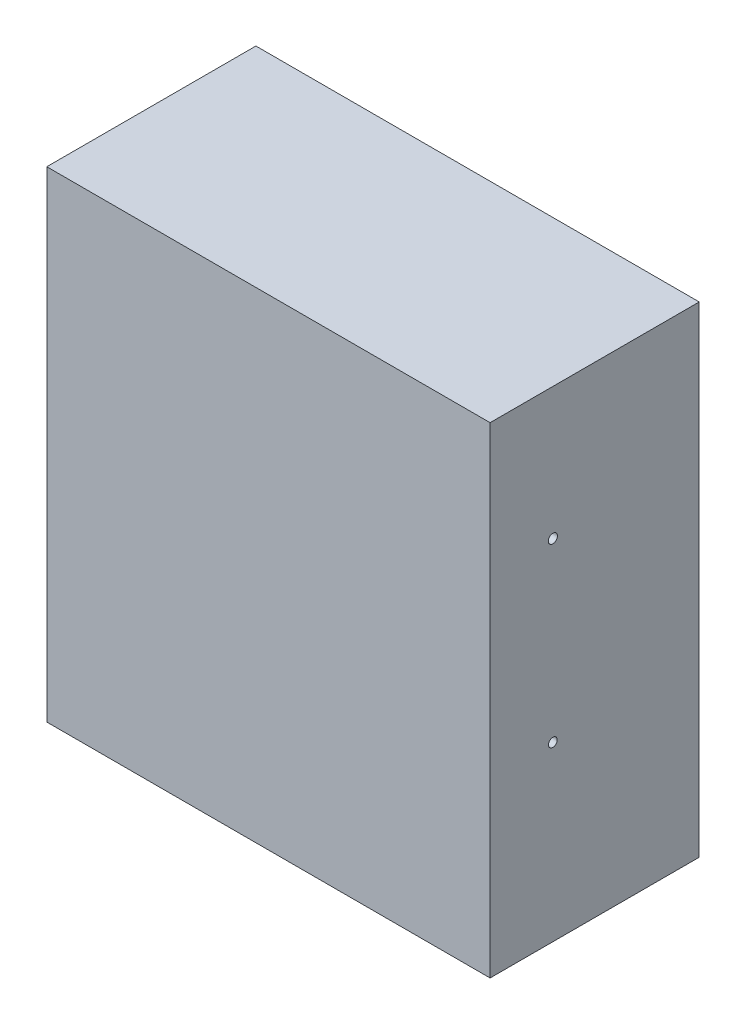
ISO-10303-21;
HEADER;
FILE_DESCRIPTION(('STEP AP214'),'2;1');
FILE_NAME('part.step','',(''),(''),'','','');
FILE_SCHEMA(('AUTOMOTIVE_DESIGN { 1 0 10303 214 1 1 1 1 }'));
ENDSEC;
DATA;
#1=APPLICATION_CONTEXT('core data for automotive mechanical design processes');
#2=APPLICATION_PROTOCOL_DEFINITION('international standard','automotive_design',2000,#1);
#3=PRODUCT_CONTEXT('',#1,'mechanical');
#4=PRODUCT('Part','Part','',(#3));
#5=PRODUCT_RELATED_PRODUCT_CATEGORY('part','',(#4));
#6=PRODUCT_DEFINITION_FORMATION('','',#4);
#7=PRODUCT_DEFINITION_CONTEXT('part definition',#1,'design');
#8=PRODUCT_DEFINITION('design','',#6,#7);
#9=PRODUCT_DEFINITION_SHAPE('','',#8);
#10=(LENGTH_UNIT() NAMED_UNIT(*) SI_UNIT(.MILLI.,.METRE.));
#11=(NAMED_UNIT(*) PLANE_ANGLE_UNIT() SI_UNIT($,.RADIAN.));
#12=(NAMED_UNIT(*) SI_UNIT($,.STERADIAN.) SOLID_ANGLE_UNIT());
#13=UNCERTAINTY_MEASURE_WITH_UNIT(LENGTH_MEASURE(1.E-05),#10,'distance_accuracy_value','');
#14=(GEOMETRIC_REPRESENTATION_CONTEXT(3) GLOBAL_UNCERTAINTY_ASSIGNED_CONTEXT((#13)) GLOBAL_UNIT_ASSIGNED_CONTEXT((#10,
#11,#12)) REPRESENTATION_CONTEXT('',''));
#15=CARTESIAN_POINT('',(0.,0.,0.));
#16=DIRECTION('',(0.,0.,1.));
#17=DIRECTION('',(1.,0.,0.));
#18=AXIS2_PLACEMENT_3D('',#15,#16,#17);
#19=CARTESIAN_POINT('',(106.,115.,100.));
#20=DIRECTION('',(-1.,0.,0.));
#21=DIRECTION('',(0.,0.,1.));
#22=AXIS2_PLACEMENT_3D('',#19,#20,#21);
#23=PLANE('',#22);
#24=CARTESIAN_POINT('',(106.,-32.4,69.9888516911841));
#25=DIRECTION('',(1.,0.,0.));
#26=DIRECTION('',(0.,0.,-1.));
#27=AXIS2_PLACEMENT_3D('',#24,#25,#26);
#28=CIRCLE('',#27,2.1);
#29=CARTESIAN_POINT('',(106.,-32.4,67.8888516911841));
#30=VERTEX_POINT('',#29);
#31=EDGE_CURVE('E186',#30,#30,#28,.T.);
#32=ORIENTED_EDGE('',*,*,#31,.F.);
#33=EDGE_LOOP('',(#32));
#34=FACE_BOUND('',#33,.T.);
#35=CARTESIAN_POINT('',(106.,52.0092126059091,69.9888516911841));
#36=DIRECTION('',(1.,0.,0.));
#37=DIRECTION('',(0.,0.,-1.));
#38=AXIS2_PLACEMENT_3D('',#35,#36,#37);
#39=CIRCLE('',#38,2.2);
#40=CARTESIAN_POINT('',(106.,52.0092126059091,67.7888516911841));
#41=VERTEX_POINT('',#40);
#42=EDGE_CURVE('E171',#41,#41,#39,.T.);
#43=ORIENTED_EDGE('',*,*,#42,.F.);
#44=EDGE_LOOP('',(#43));
#45=FACE_BOUND('',#44,.T.);
#46=DIRECTION('',(0.,1.,0.));
#47=VECTOR('',#46,1.);
#48=CARTESIAN_POINT('',(106.,115.,0.));
#49=LINE('',#48,#47);
#50=CARTESIAN_POINT('',(106.,-115.,0.));
#51=VERTEX_POINT('',#50);
#52=CARTESIAN_POINT('',(106.,115.,0.));
#53=VERTEX_POINT('',#52);
#54=EDGE_CURVE('E146',#51,#53,#49,.T.);
#55=ORIENTED_EDGE('',*,*,#54,.T.);
#56=DIRECTION('',(0.,0.,-1.));
#57=VECTOR('',#56,1.);
#58=CARTESIAN_POINT('',(106.,115.,100.));
#59=LINE('',#58,#57);
#60=CARTESIAN_POINT('',(106.,115.,100.));
#61=VERTEX_POINT('',#60);
#62=EDGE_CURVE('E11',#61,#53,#59,.T.);
#63=ORIENTED_EDGE('',*,*,#62,.F.);
#64=DIRECTION('',(0.,1.,0.));
#65=VECTOR('',#64,1.);
#66=CARTESIAN_POINT('',(106.,115.,100.));
#67=LINE('',#66,#65);
#68=CARTESIAN_POINT('',(106.,-115.,100.));
#69=VERTEX_POINT('',#68);
#70=EDGE_CURVE('E150',#69,#61,#67,.T.);
#71=ORIENTED_EDGE('',*,*,#70,.F.);
#72=DIRECTION('',(0.,0.,-1.));
#73=VECTOR('',#72,1.);
#74=CARTESIAN_POINT('',(106.,-115.,100.));
#75=LINE('',#74,#73);
#76=EDGE_CURVE('E156',#69,#51,#75,.T.);
#77=ORIENTED_EDGE('',*,*,#76,.T.);
#78=EDGE_LOOP('',(#55,#63,#71,#77));
#79=FACE_BOUND('',#78,.T.);
#80=ADVANCED_FACE('F33',(#34,#45,#79),#23,.F.);
#81=CARTESIAN_POINT('',(-106.,115.,100.));
#82=DIRECTION('',(0.,-1.,0.));
#83=DIRECTION('',(0.,0.,-1.));
#84=AXIS2_PLACEMENT_3D('',#81,#82,#83);
#85=PLANE('',#84);
#86=DIRECTION('',(-1.,0.,0.));
#87=VECTOR('',#86,1.);
#88=CARTESIAN_POINT('',(-106.,115.,0.));
#89=LINE('',#88,#87);
#90=CARTESIAN_POINT('',(-106.,115.,0.));
#91=VERTEX_POINT('',#90);
#92=EDGE_CURVE('E159',#53,#91,#89,.T.);
#93=ORIENTED_EDGE('',*,*,#92,.T.);
#94=DIRECTION('',(0.,0.,-1.));
#95=VECTOR('',#94,1.);
#96=CARTESIAN_POINT('',(-106.,115.,100.));
#97=LINE('',#96,#95);
#98=CARTESIAN_POINT('',(-106.,115.,100.));
#99=VERTEX_POINT('',#98);
#100=EDGE_CURVE('E41',#99,#91,#97,.T.);
#101=ORIENTED_EDGE('',*,*,#100,.F.);
#102=DIRECTION('',(-1.,0.,0.));
#103=VECTOR('',#102,1.);
#104=CARTESIAN_POINT('',(-106.,115.,100.));
#105=LINE('',#104,#103);
#106=EDGE_CURVE('E86',#61,#99,#105,.T.);
#107=ORIENTED_EDGE('',*,*,#106,.F.);
#108=ORIENTED_EDGE('',*,*,#62,.T.);
#109=EDGE_LOOP('',(#93,#101,#107,#108));
#110=FACE_BOUND('',#109,.T.);
#111=ADVANCED_FACE('F207',(#110),#85,.F.);
#112=CARTESIAN_POINT('',(-106.,115.,100.));
#113=DIRECTION('',(1.,0.,0.));
#114=DIRECTION('',(0.,0.,-1.));
#115=AXIS2_PLACEMENT_3D('',#112,#113,#114);
#116=PLANE('',#115);
#117=CARTESIAN_POINT('',(-106.,-32.4,69.9888516911841));
#118=DIRECTION('',(1.,0.,0.));
#119=DIRECTION('',(0.,0.,-1.));
#120=AXIS2_PLACEMENT_3D('',#117,#118,#119);
#121=CIRCLE('',#120,2.1);
#122=CARTESIAN_POINT('',(-106.,-32.4,67.8888516911841));
#123=VERTEX_POINT('',#122);
#124=EDGE_CURVE('E176',#123,#123,#121,.T.);
#125=ORIENTED_EDGE('',*,*,#124,.T.);
#126=EDGE_LOOP('',(#125));
#127=FACE_BOUND('',#126,.T.);
#128=CARTESIAN_POINT('',(-106.,52.0092126059091,69.9888516911841));
#129=DIRECTION('',(1.,0.,0.));
#130=DIRECTION('',(0.,0.,-1.));
#131=AXIS2_PLACEMENT_3D('',#128,#129,#130);
#132=CIRCLE('',#131,2.2);
#133=CARTESIAN_POINT('',(-106.,52.0092126059091,67.7888516911841));
#134=VERTEX_POINT('',#133);
#135=EDGE_CURVE('E134',#134,#134,#132,.T.);
#136=ORIENTED_EDGE('',*,*,#135,.T.);
#137=EDGE_LOOP('',(#136));
#138=FACE_BOUND('',#137,.T.);
#139=DIRECTION('',(0.,-1.,0.));
#140=VECTOR('',#139,1.);
#141=CARTESIAN_POINT('',(-106.,115.,0.));
#142=LINE('',#141,#140);
#143=CARTESIAN_POINT('',(-106.,-115.,0.));
#144=VERTEX_POINT('',#143);
#145=EDGE_CURVE('E161',#91,#144,#142,.T.);
#146=ORIENTED_EDGE('',*,*,#145,.T.);
#147=DIRECTION('',(0.,0.,-1.));
#148=VECTOR('',#147,1.);
#149=CARTESIAN_POINT('',(-106.,-115.,100.));
#150=LINE('',#149,#148);
#151=CARTESIAN_POINT('',(-106.,-115.,100.));
#152=VERTEX_POINT('',#151);
#153=EDGE_CURVE('E165',#152,#144,#150,.T.);
#154=ORIENTED_EDGE('',*,*,#153,.F.);
#155=DIRECTION('',(0.,-1.,0.));
#156=VECTOR('',#155,1.);
#157=CARTESIAN_POINT('',(-106.,115.,100.));
#158=LINE('',#157,#156);
#159=EDGE_CURVE('E153',#99,#152,#158,.T.);
#160=ORIENTED_EDGE('',*,*,#159,.F.);
#161=ORIENTED_EDGE('',*,*,#100,.T.);
#162=EDGE_LOOP('',(#146,#154,#160,#161));
#163=FACE_BOUND('',#162,.T.);
#164=ADVANCED_FACE('F203',(#127,#138,#163),#116,.F.);
#165=CARTESIAN_POINT('',(-106.,-115.,100.));
#166=DIRECTION('',(0.,1.,0.));
#167=DIRECTION('',(0.,0.,1.));
#168=AXIS2_PLACEMENT_3D('',#165,#166,#167);
#169=PLANE('',#168);
#170=DIRECTION('',(-1.,0.,0.));
#171=VECTOR('',#170,1.);
#172=CARTESIAN_POINT('',(-101.,-115.,95.));
#173=LINE('',#172,#171);
#174=CARTESIAN_POINT('',(101.,-115.,95.));
#175=VERTEX_POINT('',#174);
#176=CARTESIAN_POINT('',(-101.,-115.,95.));
#177=VERTEX_POINT('',#176);
#178=EDGE_CURVE('E140',#175,#177,#173,.T.);
#179=ORIENTED_EDGE('',*,*,#178,.F.);
#180=DIRECTION('',(0.,0.,1.));
#181=VECTOR('',#180,1.);
#182=CARTESIAN_POINT('',(101.,-115.,95.));
#183=LINE('',#182,#181);
#184=CARTESIAN_POINT('',(101.,-115.,5.));
#185=VERTEX_POINT('',#184);
#186=EDGE_CURVE('E49',#185,#175,#183,.T.);
#187=ORIENTED_EDGE('',*,*,#186,.F.);
#188=DIRECTION('',(1.,0.,0.));
#189=VECTOR('',#188,1.);
#190=CARTESIAN_POINT('',(-101.,-115.,5.));
#191=LINE('',#190,#189);
#192=CARTESIAN_POINT('',(-101.,-115.,5.));
#193=VERTEX_POINT('',#192);
#194=EDGE_CURVE('E128',#193,#185,#191,.T.);
#195=ORIENTED_EDGE('',*,*,#194,.F.);
#196=DIRECTION('',(0.,0.,-1.));
#197=VECTOR('',#196,1.);
#198=CARTESIAN_POINT('',(-101.,-115.,95.));
#199=LINE('',#198,#197);
#200=EDGE_CURVE('E131',#177,#193,#199,.T.);
#201=ORIENTED_EDGE('',*,*,#200,.F.);
#202=EDGE_LOOP('',(#179,#187,#195,#201));
#203=FACE_BOUND('',#202,.T.);
#204=DIRECTION('',(1.,0.,0.));
#205=VECTOR('',#204,1.);
#206=CARTESIAN_POINT('',(-106.,-115.,0.));
#207=LINE('',#206,#205);
#208=EDGE_CURVE('E79',#144,#51,#207,.T.);
#209=ORIENTED_EDGE('',*,*,#208,.T.);
#210=ORIENTED_EDGE('',*,*,#76,.F.);
#211=DIRECTION('',(1.,0.,0.));
#212=VECTOR('',#211,1.);
#213=CARTESIAN_POINT('',(-106.,-115.,100.));
#214=LINE('',#213,#212);
#215=EDGE_CURVE('E58',#152,#69,#214,.T.);
#216=ORIENTED_EDGE('',*,*,#215,.F.);
#217=ORIENTED_EDGE('',*,*,#153,.T.);
#218=EDGE_LOOP('',(#209,#210,#216,#217));
#219=FACE_BOUND('',#218,.T.);
#220=ADVANCED_FACE('F206',(#203,#219),#169,.F.);
#221=CARTESIAN_POINT('',(0.,0.,100.));
#222=DIRECTION('',(0.,0.,1.));
#223=DIRECTION('',(1.,0.,0.));
#224=AXIS2_PLACEMENT_3D('',#221,#222,#223);
#225=PLANE('',#224);
#226=ORIENTED_EDGE('',*,*,#70,.T.);
#227=ORIENTED_EDGE('',*,*,#106,.T.);
#228=ORIENTED_EDGE('',*,*,#159,.T.);
#229=ORIENTED_EDGE('',*,*,#215,.T.);
#230=EDGE_LOOP('',(#226,#227,#228,#229));
#231=FACE_BOUND('',#230,.T.);
#232=ADVANCED_FACE('F221',(#231),#225,.T.);
#233=CARTESIAN_POINT('',(0.,0.,0.));
#234=DIRECTION('',(0.,0.,1.));
#235=DIRECTION('',(1.,0.,0.));
#236=AXIS2_PLACEMENT_3D('',#233,#234,#235);
#237=PLANE('',#236);
#238=ORIENTED_EDGE('',*,*,#54,.F.);
#239=ORIENTED_EDGE('',*,*,#208,.F.);
#240=ORIENTED_EDGE('',*,*,#145,.F.);
#241=ORIENTED_EDGE('',*,*,#92,.F.);
#242=EDGE_LOOP('',(#238,#239,#240,#241));
#243=FACE_BOUND('',#242,.T.);
#244=ADVANCED_FACE('F217',(#243),#237,.F.);
#245=CARTESIAN_POINT('',(101.,110.,95.));
#246=DIRECTION('',(1.,0.,0.));
#247=DIRECTION('',(0.,0.,-1.));
#248=AXIS2_PLACEMENT_3D('',#245,#246,#247);
#249=PLANE('',#248);
#250=CARTESIAN_POINT('',(101.,-32.4,69.9888516911841));
#251=DIRECTION('',(1.,0.,0.));
#252=DIRECTION('',(0.,0.,-1.));
#253=AXIS2_PLACEMENT_3D('',#250,#251,#252);
#254=CIRCLE('',#253,2.1);
#255=CARTESIAN_POINT('',(101.,-32.4,67.8888516911841));
#256=VERTEX_POINT('',#255);
#257=EDGE_CURVE('E181',#256,#256,#254,.T.);
#258=ORIENTED_EDGE('',*,*,#257,.T.);
#259=EDGE_LOOP('',(#258));
#260=FACE_BOUND('',#259,.T.);
#261=CARTESIAN_POINT('',(101.,52.0092126059091,69.9888516911841));
#262=DIRECTION('',(1.,0.,0.));
#263=DIRECTION('',(0.,0.,-1.));
#264=AXIS2_PLACEMENT_3D('',#261,#262,#263);
#265=CIRCLE('',#264,2.2);
#266=CARTESIAN_POINT('',(101.,52.0092126059091,67.7888516911841));
#267=VERTEX_POINT('',#266);
#268=EDGE_CURVE('E170',#267,#267,#265,.T.);
#269=ORIENTED_EDGE('',*,*,#268,.T.);
#270=EDGE_LOOP('',(#269));
#271=FACE_BOUND('',#270,.T.);
#272=ORIENTED_EDGE('',*,*,#186,.T.);
#273=DIRECTION('',(0.,-1.,0.));
#274=VECTOR('',#273,1.);
#275=CARTESIAN_POINT('',(101.,110.,95.));
#276=LINE('',#275,#274);
#277=CARTESIAN_POINT('',(101.,110.,95.));
#278=VERTEX_POINT('',#277);
#279=EDGE_CURVE('E106',#278,#175,#276,.T.);
#280=ORIENTED_EDGE('',*,*,#279,.F.);
#281=DIRECTION('',(0.,0.,1.));
#282=VECTOR('',#281,1.);
#283=CARTESIAN_POINT('',(101.,110.,95.));
#284=LINE('',#283,#282);
#285=CARTESIAN_POINT('',(101.,110.,5.));
#286=VERTEX_POINT('',#285);
#287=EDGE_CURVE('E110',#286,#278,#284,.T.);
#288=ORIENTED_EDGE('',*,*,#287,.F.);
#289=DIRECTION('',(0.,-1.,0.));
#290=VECTOR('',#289,1.);
#291=CARTESIAN_POINT('',(101.,110.,5.));
#292=LINE('',#291,#290);
#293=EDGE_CURVE('E144',#286,#185,#292,.T.);
#294=ORIENTED_EDGE('',*,*,#293,.T.);
#295=EDGE_LOOP('',(#272,#280,#288,#294));
#296=FACE_BOUND('',#295,.T.);
#297=ADVANCED_FACE('F108',(#260,#271,#296),#249,.F.);
#298=CARTESIAN_POINT('',(-101.,110.,5.));
#299=DIRECTION('',(0.,0.,-1.));
#300=DIRECTION('',(-1.,0.,0.));
#301=AXIS2_PLACEMENT_3D('',#298,#299,#300);
#302=PLANE('',#301);
#303=ORIENTED_EDGE('',*,*,#194,.T.);
#304=ORIENTED_EDGE('',*,*,#293,.F.);
#305=DIRECTION('',(1.,0.,0.));
#306=VECTOR('',#305,1.);
#307=CARTESIAN_POINT('',(-101.,110.,5.));
#308=LINE('',#307,#306);
#309=CARTESIAN_POINT('',(-101.,110.,5.));
#310=VERTEX_POINT('',#309);
#311=EDGE_CURVE('E116',#310,#286,#308,.T.);
#312=ORIENTED_EDGE('',*,*,#311,.F.);
#313=DIRECTION('',(0.,-1.,0.));
#314=VECTOR('',#313,1.);
#315=CARTESIAN_POINT('',(-101.,110.,5.));
#316=LINE('',#315,#314);
#317=EDGE_CURVE('E147',#310,#193,#316,.T.);
#318=ORIENTED_EDGE('',*,*,#317,.T.);
#319=EDGE_LOOP('',(#303,#304,#312,#318));
#320=FACE_BOUND('',#319,.T.);
#321=ADVANCED_FACE('F237',(#320),#302,.F.);
#322=CARTESIAN_POINT('',(-101.,110.,95.));
#323=DIRECTION('',(-1.,0.,0.));
#324=DIRECTION('',(0.,0.,1.));
#325=AXIS2_PLACEMENT_3D('',#322,#323,#324);
#326=PLANE('',#325);
#327=CARTESIAN_POINT('',(-101.,-32.4,69.9888516911841));
#328=DIRECTION('',(-1.,0.,0.));
#329=DIRECTION('',(0.,0.,1.));
#330=AXIS2_PLACEMENT_3D('',#327,#328,#329);
#331=CIRCLE('',#330,2.1);
#332=CARTESIAN_POINT('',(-101.,-32.4,72.0888516911841));
#333=VERTEX_POINT('',#332);
#334=EDGE_CURVE('E36',#333,#333,#331,.T.);
#335=ORIENTED_EDGE('',*,*,#334,.T.);
#336=EDGE_LOOP('',(#335));
#337=FACE_BOUND('',#336,.T.);
#338=CARTESIAN_POINT('',(-101.,52.0092126059091,69.9888516911841));
#339=DIRECTION('',(-1.,0.,0.));
#340=DIRECTION('',(0.,0.,1.));
#341=AXIS2_PLACEMENT_3D('',#338,#339,#340);
#342=CIRCLE('',#341,2.2);
#343=CARTESIAN_POINT('',(-101.,52.0092126059091,72.1888516911841));
#344=VERTEX_POINT('',#343);
#345=EDGE_CURVE('E168',#344,#344,#342,.T.);
#346=ORIENTED_EDGE('',*,*,#345,.T.);
#347=EDGE_LOOP('',(#346));
#348=FACE_BOUND('',#347,.T.);
#349=ORIENTED_EDGE('',*,*,#200,.T.);
#350=ORIENTED_EDGE('',*,*,#317,.F.);
#351=DIRECTION('',(0.,0.,-1.));
#352=VECTOR('',#351,1.);
#353=CARTESIAN_POINT('',(-101.,110.,95.));
#354=LINE('',#353,#352);
#355=CARTESIAN_POINT('',(-101.,110.,95.));
#356=VERTEX_POINT('',#355);
#357=EDGE_CURVE('E124',#356,#310,#354,.T.);
#358=ORIENTED_EDGE('',*,*,#357,.F.);
#359=DIRECTION('',(0.,-1.,0.));
#360=VECTOR('',#359,1.);
#361=CARTESIAN_POINT('',(-101.,110.,95.));
#362=LINE('',#361,#360);
#363=EDGE_CURVE('E115',#356,#177,#362,.T.);
#364=ORIENTED_EDGE('',*,*,#363,.T.);
#365=EDGE_LOOP('',(#349,#350,#358,#364));
#366=FACE_BOUND('',#365,.T.);
#367=ADVANCED_FACE('F193',(#337,#348,#366),#326,.F.);
#368=CARTESIAN_POINT('',(-101.,110.,95.));
#369=DIRECTION('',(0.,0.,1.));
#370=DIRECTION('',(1.,0.,0.));
#371=AXIS2_PLACEMENT_3D('',#368,#369,#370);
#372=PLANE('',#371);
#373=ORIENTED_EDGE('',*,*,#178,.T.);
#374=ORIENTED_EDGE('',*,*,#363,.F.);
#375=DIRECTION('',(-1.,0.,0.));
#376=VECTOR('',#375,1.);
#377=CARTESIAN_POINT('',(-101.,110.,95.));
#378=LINE('',#377,#376);
#379=EDGE_CURVE('E119',#278,#356,#378,.T.);
#380=ORIENTED_EDGE('',*,*,#379,.F.);
#381=ORIENTED_EDGE('',*,*,#279,.T.);
#382=EDGE_LOOP('',(#373,#374,#380,#381));
#383=FACE_BOUND('',#382,.T.);
#384=ADVANCED_FACE('F120',(#383),#372,.F.);
#385=CARTESIAN_POINT('',(0.,110.,0.));
#386=DIRECTION('',(0.,-1.,0.));
#387=DIRECTION('',(0.,0.,-1.));
#388=AXIS2_PLACEMENT_3D('',#385,#386,#387);
#389=PLANE('',#388);
#390=ORIENTED_EDGE('',*,*,#287,.T.);
#391=ORIENTED_EDGE('',*,*,#379,.T.);
#392=ORIENTED_EDGE('',*,*,#357,.T.);
#393=ORIENTED_EDGE('',*,*,#311,.T.);
#394=EDGE_LOOP('',(#390,#391,#392,#393));
#395=FACE_BOUND('',#394,.T.);
#396=ADVANCED_FACE('F126',(#395),#389,.T.);
#397=CARTESIAN_POINT('',(-132.,52.0092126059091,69.9888516911841));
#398=DIRECTION('',(1.,0.,0.));
#399=DIRECTION('',(0.,0.,-1.));
#400=AXIS2_PLACEMENT_3D('',#397,#398,#399);
#401=CYLINDRICAL_SURFACE('',#400,2.2);
#402=ORIENTED_EDGE('',*,*,#345,.F.);
#403=EDGE_LOOP('',(#402));
#404=FACE_BOUND('',#403,.T.);
#405=ORIENTED_EDGE('',*,*,#135,.F.);
#406=EDGE_LOOP('',(#405));
#407=FACE_BOUND('',#406,.T.);
#408=ADVANCED_FACE('F248',(#404,#407),#401,.F.);
#409=ORIENTED_EDGE('',*,*,#42,.T.);
#410=EDGE_LOOP('',(#409));
#411=FACE_BOUND('',#410,.T.);
#412=ORIENTED_EDGE('',*,*,#268,.F.);
#413=EDGE_LOOP('',(#412));
#414=FACE_BOUND('',#413,.T.);
#415=ADVANCED_FACE('F199',(#411,#414),#401,.F.);
#416=CARTESIAN_POINT('',(-131.,-32.4,69.9888516911841));
#417=DIRECTION('',(1.,0.,0.));
#418=DIRECTION('',(0.,0.,-1.));
#419=AXIS2_PLACEMENT_3D('',#416,#417,#418);
#420=CYLINDRICAL_SURFACE('',#419,2.1);
#421=ORIENTED_EDGE('',*,*,#334,.F.);
#422=EDGE_LOOP('',(#421));
#423=FACE_BOUND('',#422,.T.);
#424=ORIENTED_EDGE('',*,*,#124,.F.);
#425=EDGE_LOOP('',(#424));
#426=FACE_BOUND('',#425,.T.);
#427=ADVANCED_FACE('F195',(#423,#426),#420,.F.);
#428=ORIENTED_EDGE('',*,*,#31,.T.);
#429=EDGE_LOOP('',(#428));
#430=FACE_BOUND('',#429,.T.);
#431=ORIENTED_EDGE('',*,*,#257,.F.);
#432=EDGE_LOOP('',(#431));
#433=FACE_BOUND('',#432,.T.);
#434=ADVANCED_FACE('F198',(#430,#433),#420,.F.);
#435=CLOSED_SHELL('',(#80,#111,#164,#220,#232,#244,#297,#321,#367,#384,#396,#408,#415,#427,#434));
#436=MANIFOLD_SOLID_BREP('B2',#435);
#437=ADVANCED_BREP_SHAPE_REPRESENTATION('',(#18,#436),#14);
#438=SHAPE_DEFINITION_REPRESENTATION(#9,#437);
ENDSEC;
END-ISO-10303-21;
